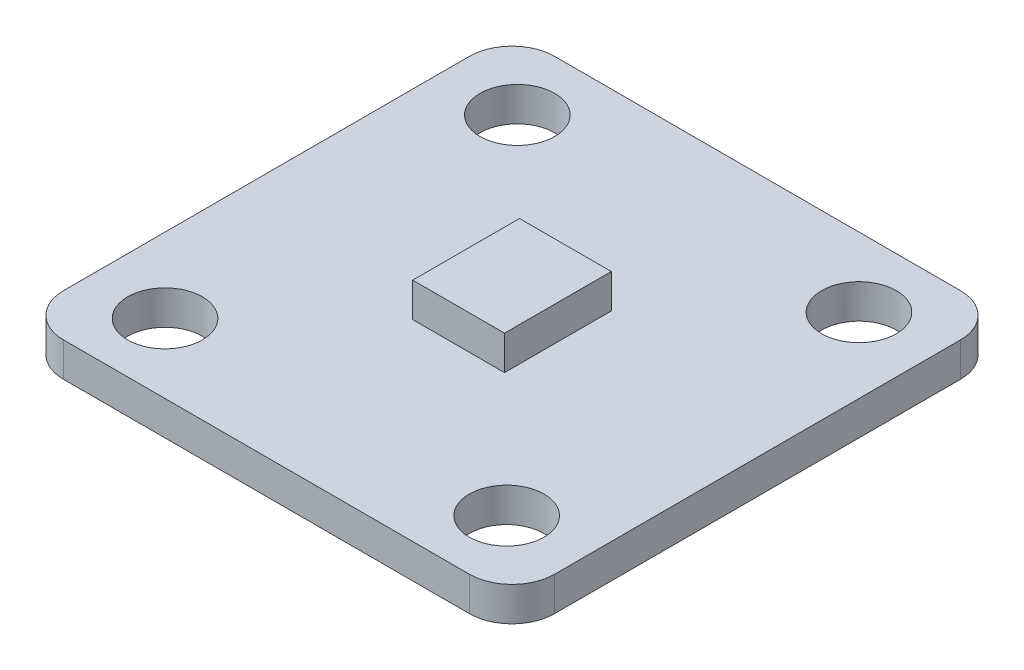
ISO-10303-21;
HEADER;
FILE_DESCRIPTION(('STEP AP214'),'2;1');
FILE_NAME('part.step','',(''),(''),'','','');
FILE_SCHEMA(('AUTOMOTIVE_DESIGN { 1 0 10303 214 1 1 1 1 }'));
ENDSEC;
DATA;
#1=APPLICATION_CONTEXT('core data for automotive mechanical design processes');
#2=APPLICATION_PROTOCOL_DEFINITION('international standard','automotive_design',2000,#1);
#3=PRODUCT_CONTEXT('',#1,'mechanical');
#4=PRODUCT('Part','Part','',(#3));
#5=PRODUCT_RELATED_PRODUCT_CATEGORY('part','',(#4));
#6=PRODUCT_DEFINITION_FORMATION('','',#4);
#7=PRODUCT_DEFINITION_CONTEXT('part definition',#1,'design');
#8=PRODUCT_DEFINITION('design','',#6,#7);
#9=PRODUCT_DEFINITION_SHAPE('','',#8);
#10=(LENGTH_UNIT() NAMED_UNIT(*) SI_UNIT(.MILLI.,.METRE.));
#11=(NAMED_UNIT(*) PLANE_ANGLE_UNIT() SI_UNIT($,.RADIAN.));
#12=(NAMED_UNIT(*) SI_UNIT($,.STERADIAN.) SOLID_ANGLE_UNIT());
#13=UNCERTAINTY_MEASURE_WITH_UNIT(LENGTH_MEASURE(1.E-05),#10,'distance_accuracy_value','');
#14=(GEOMETRIC_REPRESENTATION_CONTEXT(3) GLOBAL_UNCERTAINTY_ASSIGNED_CONTEXT((#13)) GLOBAL_UNIT_ASSIGNED_CONTEXT((#10,
#11,#12)) REPRESENTATION_CONTEXT('',''));
#15=CARTESIAN_POINT('',(0.,0.,0.));
#16=DIRECTION('',(0.,0.,1.));
#17=DIRECTION('',(1.,0.,0.));
#18=AXIS2_PLACEMENT_3D('',#15,#16,#17);
#19=CARTESIAN_POINT('',(0.,1.6,0.));
#20=DIRECTION('',(0.,1.,0.));
#21=DIRECTION('',(0.,0.,1.));
#22=AXIS2_PLACEMENT_3D('',#19,#20,#21);
#23=PLANE('',#22);
#24=CARTESIAN_POINT('',(-8.,1.6,8.25));
#25=DIRECTION('',(0.,1.,0.));
#26=DIRECTION('',(0.,0.,-1.));
#27=AXIS2_PLACEMENT_3D('',#24,#25,#26);
#28=CIRCLE('',#27,1.75);
#29=CARTESIAN_POINT('',(-8.,1.6,6.5));
#30=VERTEX_POINT('',#29);
#31=EDGE_CURVE('E150',#30,#30,#28,.T.);
#32=ORIENTED_EDGE('',*,*,#31,.F.);
#33=EDGE_LOOP('',(#32));
#34=FACE_BOUND('',#33,.T.);
#35=CARTESIAN_POINT('',(8.,1.6,8.25));
#36=DIRECTION('',(0.,1.,0.));
#37=DIRECTION('',(0.,0.,1.));
#38=AXIS2_PLACEMENT_3D('',#35,#36,#37);
#39=CIRCLE('',#38,1.75);
#40=CARTESIAN_POINT('',(8.,1.6,10.));
#41=VERTEX_POINT('',#40);
#42=EDGE_CURVE('E166',#41,#41,#39,.T.);
#43=ORIENTED_EDGE('',*,*,#42,.F.);
#44=EDGE_LOOP('',(#43));
#45=FACE_BOUND('',#44,.T.);
#46=CARTESIAN_POINT('',(8.,1.6,-8.25));
#47=DIRECTION('',(0.,1.,0.));
#48=DIRECTION('',(0.,0.,-1.));
#49=AXIS2_PLACEMENT_3D('',#46,#47,#48);
#50=CIRCLE('',#49,1.75);
#51=CARTESIAN_POINT('',(8.,1.6,-10.));
#52=VERTEX_POINT('',#51);
#53=EDGE_CURVE('E158',#52,#52,#50,.T.);
#54=ORIENTED_EDGE('',*,*,#53,.F.);
#55=EDGE_LOOP('',(#54));
#56=FACE_BOUND('',#55,.T.);
#57=CARTESIAN_POINT('',(-8.,1.6,-8.25));
#58=DIRECTION('',(0.,1.,0.));
#59=DIRECTION('',(0.,0.,1.));
#60=AXIS2_PLACEMENT_3D('',#57,#58,#59);
#61=CIRCLE('',#60,1.75);
#62=CARTESIAN_POINT('',(-8.,1.6,-6.5));
#63=VERTEX_POINT('',#62);
#64=EDGE_CURVE('E165',#63,#63,#61,.T.);
#65=ORIENTED_EDGE('',*,*,#64,.F.);
#66=EDGE_LOOP('',(#65));
#67=FACE_BOUND('',#66,.T.);
#68=DIRECTION('',(-1.,0.,0.));
#69=VECTOR('',#68,1.);
#70=CARTESIAN_POINT('',(-11.5,1.6,-11.5));
#71=LINE('',#70,#69);
#72=CARTESIAN_POINT('',(9.49999999999999,1.6,-11.5));
#73=VERTEX_POINT('',#72);
#74=CARTESIAN_POINT('',(-9.5,1.6,-11.5));
#75=VERTEX_POINT('',#74);
#76=EDGE_CURVE('E182',#73,#75,#71,.T.);
#77=ORIENTED_EDGE('',*,*,#76,.T.);
#78=CARTESIAN_POINT('',(-9.5,1.6,-9.5));
#79=DIRECTION('',(0.,1.,0.));
#80=DIRECTION('',(0.,0.,1.));
#81=AXIS2_PLACEMENT_3D('',#78,#79,#80);
#82=CIRCLE('',#81,2.);
#83=CARTESIAN_POINT('',(-11.5,1.6,-9.5));
#84=VERTEX_POINT('',#83);
#85=EDGE_CURVE('E224',#75,#84,#82,.T.);
#86=ORIENTED_EDGE('',*,*,#85,.T.);
#87=DIRECTION('',(0.,0.,1.));
#88=VECTOR('',#87,1.);
#89=CARTESIAN_POINT('',(-11.5,1.6,-11.5));
#90=LINE('',#89,#88);
#91=CARTESIAN_POINT('',(-11.5,1.6,9.5));
#92=VERTEX_POINT('',#91);
#93=EDGE_CURVE('E186',#84,#92,#90,.T.);
#94=ORIENTED_EDGE('',*,*,#93,.T.);
#95=CARTESIAN_POINT('',(-9.5,1.6,9.5));
#96=DIRECTION('',(0.,1.,0.));
#97=DIRECTION('',(0.,0.,1.));
#98=AXIS2_PLACEMENT_3D('',#95,#96,#97);
#99=CIRCLE('',#98,2.);
#100=CARTESIAN_POINT('',(-9.5,1.6,11.5));
#101=VERTEX_POINT('',#100);
#102=EDGE_CURVE('E218',#92,#101,#99,.T.);
#103=ORIENTED_EDGE('',*,*,#102,.T.);
#104=DIRECTION('',(1.,0.,0.));
#105=VECTOR('',#104,1.);
#106=CARTESIAN_POINT('',(-11.5,1.6,11.5));
#107=LINE('',#106,#105);
#108=CARTESIAN_POINT('',(9.5,1.6,11.5));
#109=VERTEX_POINT('',#108);
#110=EDGE_CURVE('E189',#101,#109,#107,.T.);
#111=ORIENTED_EDGE('',*,*,#110,.T.);
#112=CARTESIAN_POINT('',(9.5,1.6,9.5));
#113=DIRECTION('',(0.,1.,0.));
#114=DIRECTION('',(0.,0.,1.));
#115=AXIS2_PLACEMENT_3D('',#112,#113,#114);
#116=CIRCLE('',#115,2.);
#117=CARTESIAN_POINT('',(11.5,1.6,9.5));
#118=VERTEX_POINT('',#117);
#119=EDGE_CURVE('E220',#109,#118,#116,.T.);
#120=ORIENTED_EDGE('',*,*,#119,.T.);
#121=DIRECTION('',(0.,0.,-1.));
#122=VECTOR('',#121,1.);
#123=CARTESIAN_POINT('',(11.5,1.6,-11.5));
#124=LINE('',#123,#122);
#125=CARTESIAN_POINT('',(11.5,1.6,-9.5));
#126=VERTEX_POINT('',#125);
#127=EDGE_CURVE('E179',#118,#126,#124,.T.);
#128=ORIENTED_EDGE('',*,*,#127,.T.);
#129=CARTESIAN_POINT('',(9.49999999999999,1.6,-9.5));
#130=DIRECTION('',(0.,1.,0.));
#131=DIRECTION('',(0.,0.,1.));
#132=AXIS2_PLACEMENT_3D('',#129,#130,#131);
#133=CIRCLE('',#132,2.);
#134=EDGE_CURVE('E222',#126,#73,#133,.T.);
#135=ORIENTED_EDGE('',*,*,#134,.T.);
#136=EDGE_LOOP('',(#77,#86,#94,#103,#111,#120,#128,#135));
#137=FACE_BOUND('',#136,.T.);
#138=DIRECTION('',(-1.,0.,0.));
#139=VECTOR('',#138,1.);
#140=CARTESIAN_POINT('',(-2.15,1.6,-2.5));
#141=LINE('',#140,#139);
#142=CARTESIAN_POINT('',(2.15,1.6,-2.5));
#143=VERTEX_POINT('',#142);
#144=CARTESIAN_POINT('',(-2.15,1.6,-2.5));
#145=VERTEX_POINT('',#144);
#146=EDGE_CURVE('E410',#143,#145,#141,.T.);
#147=ORIENTED_EDGE('',*,*,#146,.F.);
#148=DIRECTION('',(0.,0.,-1.));
#149=VECTOR('',#148,1.);
#150=CARTESIAN_POINT('',(2.15,1.6,-2.5));
#151=LINE('',#150,#149);
#152=CARTESIAN_POINT('',(2.15,1.6,2.5));
#153=VERTEX_POINT('',#152);
#154=EDGE_CURVE('E148',#153,#143,#151,.T.);
#155=ORIENTED_EDGE('',*,*,#154,.F.);
#156=DIRECTION('',(1.,0.,0.));
#157=VECTOR('',#156,1.);
#158=CARTESIAN_POINT('',(-2.15,1.6,2.5));
#159=LINE('',#158,#157);
#160=CARTESIAN_POINT('',(-2.15,1.6,2.5));
#161=VERTEX_POINT('',#160);
#162=EDGE_CURVE('E144',#161,#153,#159,.T.);
#163=ORIENTED_EDGE('',*,*,#162,.F.);
#164=DIRECTION('',(0.,0.,1.));
#165=VECTOR('',#164,1.);
#166=CARTESIAN_POINT('',(-2.15,1.6,-2.5));
#167=LINE('',#166,#165);
#168=EDGE_CURVE('E407',#145,#161,#167,.T.);
#169=ORIENTED_EDGE('',*,*,#168,.F.);
#170=EDGE_LOOP('',(#147,#155,#163,#169));
#171=FACE_BOUND('',#170,.T.);
#172=ADVANCED_FACE('F36',(#34,#45,#56,#67,#137,#171),#23,.T.);
#173=CARTESIAN_POINT('',(11.5,1.6,-11.5));
#174=DIRECTION('',(-1.,0.,0.));
#175=DIRECTION('',(0.,0.,1.));
#176=AXIS2_PLACEMENT_3D('',#173,#174,#175);
#177=PLANE('',#176);
#178=DIRECTION('',(0.,0.,-1.));
#179=VECTOR('',#178,1.);
#180=CARTESIAN_POINT('',(11.5,0.,-11.5));
#181=LINE('',#180,#179);
#182=CARTESIAN_POINT('',(11.5,0.,9.5));
#183=VERTEX_POINT('',#182);
#184=CARTESIAN_POINT('',(11.5,0.,-9.5));
#185=VERTEX_POINT('',#184);
#186=EDGE_CURVE('E178',#183,#185,#181,.T.);
#187=ORIENTED_EDGE('',*,*,#186,.T.);
#188=DIRECTION('',(0.,-1.,0.));
#189=VECTOR('',#188,1.);
#190=CARTESIAN_POINT('',(11.5,1.6,-9.5));
#191=LINE('',#190,#189);
#192=EDGE_CURVE('E229',#185,#126,#191,.F.);
#193=ORIENTED_EDGE('',*,*,#192,.T.);
#194=ORIENTED_EDGE('',*,*,#127,.F.);
#195=DIRECTION('',(0.,-1.,0.));
#196=VECTOR('',#195,1.);
#197=CARTESIAN_POINT('',(11.5,1.6,9.5));
#198=LINE('',#197,#196);
#199=EDGE_CURVE('E226',#118,#183,#198,.T.);
#200=ORIENTED_EDGE('',*,*,#199,.T.);
#201=EDGE_LOOP('',(#187,#193,#194,#200));
#202=FACE_BOUND('',#201,.T.);
#203=ADVANCED_FACE('F246',(#202),#177,.F.);
#204=CARTESIAN_POINT('',(-11.5,1.6,-11.5));
#205=DIRECTION('',(0.,0.,1.));
#206=DIRECTION('',(1.,0.,0.));
#207=AXIS2_PLACEMENT_3D('',#204,#205,#206);
#208=PLANE('',#207);
#209=DIRECTION('',(-1.,0.,0.));
#210=VECTOR('',#209,1.);
#211=CARTESIAN_POINT('',(-11.5,0.,-11.5));
#212=LINE('',#211,#210);
#213=CARTESIAN_POINT('',(9.49999999999999,0.,-11.5));
#214=VERTEX_POINT('',#213);
#215=CARTESIAN_POINT('',(-9.5,0.,-11.5));
#216=VERTEX_POINT('',#215);
#217=EDGE_CURVE('E194',#214,#216,#212,.T.);
#218=ORIENTED_EDGE('',*,*,#217,.T.);
#219=DIRECTION('',(0.,-1.,0.));
#220=VECTOR('',#219,1.);
#221=CARTESIAN_POINT('',(-9.5,1.6,-11.5));
#222=LINE('',#221,#220);
#223=EDGE_CURVE('E216',#216,#75,#222,.F.);
#224=ORIENTED_EDGE('',*,*,#223,.T.);
#225=ORIENTED_EDGE('',*,*,#76,.F.);
#226=DIRECTION('',(0.,-1.,0.));
#227=VECTOR('',#226,1.);
#228=CARTESIAN_POINT('',(9.49999999999999,1.6,-11.5));
#229=LINE('',#228,#227);
#230=EDGE_CURVE('E213',#73,#214,#229,.T.);
#231=ORIENTED_EDGE('',*,*,#230,.T.);
#232=EDGE_LOOP('',(#218,#224,#225,#231));
#233=FACE_BOUND('',#232,.T.);
#234=ADVANCED_FACE('F257',(#233),#208,.F.);
#235=CARTESIAN_POINT('',(-11.5,1.6,-11.5));
#236=DIRECTION('',(1.,0.,0.));
#237=DIRECTION('',(0.,0.,-1.));
#238=AXIS2_PLACEMENT_3D('',#235,#236,#237);
#239=PLANE('',#238);
#240=ORIENTED_EDGE('',*,*,#93,.F.);
#241=DIRECTION('',(0.,-1.,0.));
#242=VECTOR('',#241,1.);
#243=CARTESIAN_POINT('',(-11.5,1.6,-9.5));
#244=LINE('',#243,#242);
#245=CARTESIAN_POINT('',(-11.5,0.,-9.5));
#246=VERTEX_POINT('',#245);
#247=EDGE_CURVE('E202',#84,#246,#244,.T.);
#248=ORIENTED_EDGE('',*,*,#247,.T.);
#249=DIRECTION('',(0.,0.,1.));
#250=VECTOR('',#249,1.);
#251=CARTESIAN_POINT('',(-11.5,0.,-11.5));
#252=LINE('',#251,#250);
#253=CARTESIAN_POINT('',(-11.5,0.,9.5));
#254=VERTEX_POINT('',#253);
#255=EDGE_CURVE('E197',#246,#254,#252,.T.);
#256=ORIENTED_EDGE('',*,*,#255,.T.);
#257=DIRECTION('',(0.,-1.,0.));
#258=VECTOR('',#257,1.);
#259=CARTESIAN_POINT('',(-11.5,1.6,9.5));
#260=LINE('',#259,#258);
#261=EDGE_CURVE('E191',#254,#92,#260,.F.);
#262=ORIENTED_EDGE('',*,*,#261,.T.);
#263=EDGE_LOOP('',(#240,#248,#256,#262));
#264=FACE_BOUND('',#263,.T.);
#265=ADVANCED_FACE('F265',(#264),#239,.F.);
#266=CARTESIAN_POINT('',(-11.5,1.6,11.5));
#267=DIRECTION('',(0.,0.,-1.));
#268=DIRECTION('',(-1.,0.,0.));
#269=AXIS2_PLACEMENT_3D('',#266,#267,#268);
#270=PLANE('',#269);
#271=DIRECTION('',(1.,0.,0.));
#272=VECTOR('',#271,1.);
#273=CARTESIAN_POINT('',(-11.5,0.,11.5));
#274=LINE('',#273,#272);
#275=CARTESIAN_POINT('',(-9.5,0.,11.5));
#276=VERTEX_POINT('',#275);
#277=CARTESIAN_POINT('',(9.5,0.,11.5));
#278=VERTEX_POINT('',#277);
#279=EDGE_CURVE('E183',#276,#278,#274,.T.);
#280=ORIENTED_EDGE('',*,*,#279,.T.);
#281=DIRECTION('',(0.,-1.,0.));
#282=VECTOR('',#281,1.);
#283=CARTESIAN_POINT('',(9.5,1.6,11.5));
#284=LINE('',#283,#282);
#285=EDGE_CURVE('E11',#278,#109,#284,.F.);
#286=ORIENTED_EDGE('',*,*,#285,.T.);
#287=ORIENTED_EDGE('',*,*,#110,.F.);
#288=DIRECTION('',(0.,-1.,0.));
#289=VECTOR('',#288,1.);
#290=CARTESIAN_POINT('',(-9.5,1.6,11.5));
#291=LINE('',#290,#289);
#292=EDGE_CURVE('E44',#101,#276,#291,.T.);
#293=ORIENTED_EDGE('',*,*,#292,.T.);
#294=EDGE_LOOP('',(#280,#286,#287,#293));
#295=FACE_BOUND('',#294,.T.);
#296=ADVANCED_FACE('F233',(#295),#270,.F.);
#297=CARTESIAN_POINT('',(0.,0.,0.));
#298=DIRECTION('',(0.,1.,0.));
#299=DIRECTION('',(0.,0.,1.));
#300=AXIS2_PLACEMENT_3D('',#297,#298,#299);
#301=PLANE('',#300);
#302=CARTESIAN_POINT('',(-8.,0.,8.25));
#303=DIRECTION('',(0.,1.,0.));
#304=DIRECTION('',(0.,0.,1.));
#305=AXIS2_PLACEMENT_3D('',#302,#303,#304);
#306=CIRCLE('',#305,1.75);
#307=CARTESIAN_POINT('',(-8.,0.,10.));
#308=VERTEX_POINT('',#307);
#309=EDGE_CURVE('E153',#308,#308,#306,.F.);
#310=ORIENTED_EDGE('',*,*,#309,.F.);
#311=EDGE_LOOP('',(#310));
#312=FACE_BOUND('',#311,.T.);
#313=CARTESIAN_POINT('',(8.,0.,8.25));
#314=DIRECTION('',(0.,1.,0.));
#315=DIRECTION('',(0.,0.,1.));
#316=AXIS2_PLACEMENT_3D('',#313,#314,#315);
#317=CIRCLE('',#316,1.75);
#318=CARTESIAN_POINT('',(8.,0.,10.));
#319=VERTEX_POINT('',#318);
#320=EDGE_CURVE('E162',#319,#319,#317,.F.);
#321=ORIENTED_EDGE('',*,*,#320,.F.);
#322=EDGE_LOOP('',(#321));
#323=FACE_BOUND('',#322,.T.);
#324=CARTESIAN_POINT('',(8.,0.,-8.25));
#325=DIRECTION('',(0.,1.,0.));
#326=DIRECTION('',(0.,0.,1.));
#327=AXIS2_PLACEMENT_3D('',#324,#325,#326);
#328=CIRCLE('',#327,1.75);
#329=CARTESIAN_POINT('',(8.,0.,-6.5));
#330=VERTEX_POINT('',#329);
#331=EDGE_CURVE('E161',#330,#330,#328,.F.);
#332=ORIENTED_EDGE('',*,*,#331,.F.);
#333=EDGE_LOOP('',(#332));
#334=FACE_BOUND('',#333,.T.);
#335=CARTESIAN_POINT('',(-8.,0.,-8.25));
#336=DIRECTION('',(0.,1.,0.));
#337=DIRECTION('',(0.,0.,1.));
#338=AXIS2_PLACEMENT_3D('',#335,#336,#337);
#339=CIRCLE('',#338,1.75);
#340=CARTESIAN_POINT('',(-8.,0.,-6.5));
#341=VERTEX_POINT('',#340);
#342=EDGE_CURVE('E175',#341,#341,#339,.F.);
#343=ORIENTED_EDGE('',*,*,#342,.F.);
#344=EDGE_LOOP('',(#343));
#345=FACE_BOUND('',#344,.T.);
#346=ORIENTED_EDGE('',*,*,#255,.F.);
#347=CARTESIAN_POINT('',(-9.5,0.,-9.5));
#348=DIRECTION('',(0.,1.,0.));
#349=DIRECTION('',(0.,0.,1.));
#350=AXIS2_PLACEMENT_3D('',#347,#348,#349);
#351=CIRCLE('',#350,2.);
#352=EDGE_CURVE('E211',#246,#216,#351,.F.);
#353=ORIENTED_EDGE('',*,*,#352,.T.);
#354=ORIENTED_EDGE('',*,*,#217,.F.);
#355=CARTESIAN_POINT('',(9.49999999999999,0.,-9.5));
#356=DIRECTION('',(0.,1.,0.));
#357=DIRECTION('',(0.,0.,1.));
#358=AXIS2_PLACEMENT_3D('',#355,#356,#357);
#359=CIRCLE('',#358,2.);
#360=EDGE_CURVE('E209',#214,#185,#359,.F.);
#361=ORIENTED_EDGE('',*,*,#360,.T.);
#362=ORIENTED_EDGE('',*,*,#186,.F.);
#363=CARTESIAN_POINT('',(9.5,0.,9.5));
#364=DIRECTION('',(0.,1.,0.));
#365=DIRECTION('',(0.,0.,1.));
#366=AXIS2_PLACEMENT_3D('',#363,#364,#365);
#367=CIRCLE('',#366,2.);
#368=EDGE_CURVE('E207',#183,#278,#367,.F.);
#369=ORIENTED_EDGE('',*,*,#368,.T.);
#370=ORIENTED_EDGE('',*,*,#279,.F.);
#371=CARTESIAN_POINT('',(-9.5,0.,9.5));
#372=DIRECTION('',(0.,1.,0.));
#373=DIRECTION('',(0.,0.,1.));
#374=AXIS2_PLACEMENT_3D('',#371,#372,#373);
#375=CIRCLE('',#374,2.);
#376=EDGE_CURVE('E205',#276,#254,#375,.F.);
#377=ORIENTED_EDGE('',*,*,#376,.T.);
#378=EDGE_LOOP('',(#346,#353,#354,#361,#362,#369,#370,#377));
#379=FACE_BOUND('',#378,.T.);
#380=ADVANCED_FACE('F238',(#312,#323,#334,#345,#379),#301,.F.);
#381=CARTESIAN_POINT('',(-9.5,1.6,-9.5));
#382=DIRECTION('',(0.,-1.,0.));
#383=DIRECTION('',(0.,0.,-1.));
#384=AXIS2_PLACEMENT_3D('',#381,#382,#383);
#385=CYLINDRICAL_SURFACE('',#384,2.);
#386=ORIENTED_EDGE('',*,*,#85,.F.);
#387=ORIENTED_EDGE('',*,*,#223,.F.);
#388=ORIENTED_EDGE('',*,*,#352,.F.);
#389=ORIENTED_EDGE('',*,*,#247,.F.);
#390=EDGE_LOOP('',(#386,#387,#388,#389));
#391=FACE_BOUND('',#390,.T.);
#392=ADVANCED_FACE('F262',(#391),#385,.T.);
#393=CARTESIAN_POINT('',(9.49999999999999,1.6,-9.5));
#394=DIRECTION('',(0.,-1.,0.));
#395=DIRECTION('',(0.,0.,-1.));
#396=AXIS2_PLACEMENT_3D('',#393,#394,#395);
#397=CYLINDRICAL_SURFACE('',#396,2.);
#398=ORIENTED_EDGE('',*,*,#134,.F.);
#399=ORIENTED_EDGE('',*,*,#192,.F.);
#400=ORIENTED_EDGE('',*,*,#360,.F.);
#401=ORIENTED_EDGE('',*,*,#230,.F.);
#402=EDGE_LOOP('',(#398,#399,#400,#401));
#403=FACE_BOUND('',#402,.T.);
#404=ADVANCED_FACE('F254',(#403),#397,.T.);
#405=CARTESIAN_POINT('',(9.5,1.6,9.5));
#406=DIRECTION('',(0.,-1.,0.));
#407=DIRECTION('',(0.,0.,-1.));
#408=AXIS2_PLACEMENT_3D('',#405,#406,#407);
#409=CYLINDRICAL_SURFACE('',#408,2.);
#410=ORIENTED_EDGE('',*,*,#119,.F.);
#411=ORIENTED_EDGE('',*,*,#285,.F.);
#412=ORIENTED_EDGE('',*,*,#368,.F.);
#413=ORIENTED_EDGE('',*,*,#199,.F.);
#414=EDGE_LOOP('',(#410,#411,#412,#413));
#415=FACE_BOUND('',#414,.T.);
#416=ADVANCED_FACE('F243',(#415),#409,.T.);
#417=CARTESIAN_POINT('',(-9.5,1.6,9.5));
#418=DIRECTION('',(0.,-1.,0.));
#419=DIRECTION('',(0.,0.,-1.));
#420=AXIS2_PLACEMENT_3D('',#417,#418,#419);
#421=CYLINDRICAL_SURFACE('',#420,2.);
#422=ORIENTED_EDGE('',*,*,#102,.F.);
#423=ORIENTED_EDGE('',*,*,#261,.F.);
#424=ORIENTED_EDGE('',*,*,#376,.F.);
#425=ORIENTED_EDGE('',*,*,#292,.F.);
#426=EDGE_LOOP('',(#422,#423,#424,#425));
#427=FACE_BOUND('',#426,.T.);
#428=ADVANCED_FACE('F38',(#427),#421,.T.);
#429=CARTESIAN_POINT('',(-8.,-0.000999999999999916,-8.25));
#430=DIRECTION('',(0.,1.,0.));
#431=DIRECTION('',(0.,0.,1.));
#432=AXIS2_PLACEMENT_3D('',#429,#430,#431);
#433=CYLINDRICAL_SURFACE('',#432,1.75);
#434=ORIENTED_EDGE('',*,*,#64,.T.);
#435=EDGE_LOOP('',(#434));
#436=FACE_BOUND('',#435,.T.);
#437=ORIENTED_EDGE('',*,*,#342,.T.);
#438=EDGE_LOOP('',(#437));
#439=FACE_BOUND('',#438,.T.);
#440=ADVANCED_FACE('F268',(#436,#439),#433,.F.);
#441=CARTESIAN_POINT('',(8.,-0.000999999999999916,-8.25));
#442=DIRECTION('',(0.,1.,0.));
#443=DIRECTION('',(0.,0.,1.));
#444=AXIS2_PLACEMENT_3D('',#441,#442,#443);
#445=CYLINDRICAL_SURFACE('',#444,1.75);
#446=ORIENTED_EDGE('',*,*,#53,.T.);
#447=EDGE_LOOP('',(#446));
#448=FACE_BOUND('',#447,.T.);
#449=ORIENTED_EDGE('',*,*,#331,.T.);
#450=EDGE_LOOP('',(#449));
#451=FACE_BOUND('',#450,.T.);
#452=ADVANCED_FACE('F273',(#448,#451),#445,.F.);
#453=CARTESIAN_POINT('',(8.,-0.000999999999999916,8.25));
#454=DIRECTION('',(0.,1.,0.));
#455=DIRECTION('',(0.,0.,1.));
#456=AXIS2_PLACEMENT_3D('',#453,#454,#455);
#457=CYLINDRICAL_SURFACE('',#456,1.75);
#458=ORIENTED_EDGE('',*,*,#42,.T.);
#459=EDGE_LOOP('',(#458));
#460=FACE_BOUND('',#459,.T.);
#461=ORIENTED_EDGE('',*,*,#320,.T.);
#462=EDGE_LOOP('',(#461));
#463=FACE_BOUND('',#462,.T.);
#464=ADVANCED_FACE('F334',(#460,#463),#457,.F.);
#465=CARTESIAN_POINT('',(-8.,-0.000999999999999916,8.25));
#466=DIRECTION('',(0.,1.,0.));
#467=DIRECTION('',(0.,0.,1.));
#468=AXIS2_PLACEMENT_3D('',#465,#466,#467);
#469=CYLINDRICAL_SURFACE('',#468,1.75);
#470=ORIENTED_EDGE('',*,*,#31,.T.);
#471=EDGE_LOOP('',(#470));
#472=FACE_BOUND('',#471,.T.);
#473=ORIENTED_EDGE('',*,*,#309,.T.);
#474=EDGE_LOOP('',(#473));
#475=FACE_BOUND('',#474,.T.);
#476=ADVANCED_FACE('F344',(#472,#475),#469,.F.);
#477=CARTESIAN_POINT('',(2.15,3.2,-2.5));
#478=DIRECTION('',(-1.,0.,0.));
#479=DIRECTION('',(0.,0.,1.));
#480=AXIS2_PLACEMENT_3D('',#477,#478,#479);
#481=PLANE('',#480);
#482=ORIENTED_EDGE('',*,*,#154,.T.);
#483=DIRECTION('',(0.,-1.,0.));
#484=VECTOR('',#483,1.);
#485=CARTESIAN_POINT('',(2.15,3.2,-2.5));
#486=LINE('',#485,#484);
#487=CARTESIAN_POINT('',(2.15,3.2,-2.5));
#488=VERTEX_POINT('',#487);
#489=EDGE_CURVE('E129',#488,#143,#486,.T.);
#490=ORIENTED_EDGE('',*,*,#489,.F.);
#491=DIRECTION('',(0.,0.,-1.));
#492=VECTOR('',#491,1.);
#493=CARTESIAN_POINT('',(2.15,3.2,-2.5));
#494=LINE('',#493,#492);
#495=CARTESIAN_POINT('',(2.15,3.2,2.5));
#496=VERTEX_POINT('',#495);
#497=EDGE_CURVE('E136',#496,#488,#494,.T.);
#498=ORIENTED_EDGE('',*,*,#497,.F.);
#499=DIRECTION('',(0.,-1.,0.));
#500=VECTOR('',#499,1.);
#501=CARTESIAN_POINT('',(2.15,3.2,2.5));
#502=LINE('',#501,#500);
#503=EDGE_CURVE('E405',#496,#153,#502,.T.);
#504=ORIENTED_EDGE('',*,*,#503,.T.);
#505=EDGE_LOOP('',(#482,#490,#498,#504));
#506=FACE_BOUND('',#505,.T.);
#507=ADVANCED_FACE('F146',(#506),#481,.F.);
#508=CARTESIAN_POINT('',(-2.15,3.2,-2.5));
#509=DIRECTION('',(0.,0.,1.));
#510=DIRECTION('',(1.,0.,0.));
#511=AXIS2_PLACEMENT_3D('',#508,#509,#510);
#512=PLANE('',#511);
#513=ORIENTED_EDGE('',*,*,#146,.T.);
#514=DIRECTION('',(0.,-1.,0.));
#515=VECTOR('',#514,1.);
#516=CARTESIAN_POINT('',(-2.15,3.2,-2.5));
#517=LINE('',#516,#515);
#518=CARTESIAN_POINT('',(-2.15,3.2,-2.5));
#519=VERTEX_POINT('',#518);
#520=EDGE_CURVE('E132',#519,#145,#517,.T.);
#521=ORIENTED_EDGE('',*,*,#520,.F.);
#522=DIRECTION('',(-1.,0.,0.));
#523=VECTOR('',#522,1.);
#524=CARTESIAN_POINT('',(-2.15,3.2,-2.5));
#525=LINE('',#524,#523);
#526=EDGE_CURVE('E125',#488,#519,#525,.T.);
#527=ORIENTED_EDGE('',*,*,#526,.F.);
#528=ORIENTED_EDGE('',*,*,#489,.T.);
#529=EDGE_LOOP('',(#513,#521,#527,#528));
#530=FACE_BOUND('',#529,.T.);
#531=ADVANCED_FACE('F127',(#530),#512,.F.);
#532=CARTESIAN_POINT('',(-2.15,3.2,-2.5));
#533=DIRECTION('',(1.,0.,0.));
#534=DIRECTION('',(0.,0.,-1.));
#535=AXIS2_PLACEMENT_3D('',#532,#533,#534);
#536=PLANE('',#535);
#537=ORIENTED_EDGE('',*,*,#168,.T.);
#538=DIRECTION('',(0.,-1.,0.));
#539=VECTOR('',#538,1.);
#540=CARTESIAN_POINT('',(-2.15,3.2,2.5));
#541=LINE('',#540,#539);
#542=CARTESIAN_POINT('',(-2.15,3.2,2.5));
#543=VERTEX_POINT('',#542);
#544=EDGE_CURVE('E51',#543,#161,#541,.T.);
#545=ORIENTED_EDGE('',*,*,#544,.F.);
#546=DIRECTION('',(0.,0.,1.));
#547=VECTOR('',#546,1.);
#548=CARTESIAN_POINT('',(-2.15,3.2,-2.5));
#549=LINE('',#548,#547);
#550=EDGE_CURVE('E135',#519,#543,#549,.T.);
#551=ORIENTED_EDGE('',*,*,#550,.F.);
#552=ORIENTED_EDGE('',*,*,#520,.T.);
#553=EDGE_LOOP('',(#537,#545,#551,#552));
#554=FACE_BOUND('',#553,.T.);
#555=ADVANCED_FACE('F374',(#554),#536,.F.);
#556=CARTESIAN_POINT('',(-2.15,3.2,2.5));
#557=DIRECTION('',(0.,0.,-1.));
#558=DIRECTION('',(-1.,0.,0.));
#559=AXIS2_PLACEMENT_3D('',#556,#557,#558);
#560=PLANE('',#559);
#561=ORIENTED_EDGE('',*,*,#162,.T.);
#562=ORIENTED_EDGE('',*,*,#503,.F.);
#563=DIRECTION('',(1.,0.,0.));
#564=VECTOR('',#563,1.);
#565=CARTESIAN_POINT('',(-2.15,3.2,2.5));
#566=LINE('',#565,#564);
#567=EDGE_CURVE('E140',#543,#496,#566,.T.);
#568=ORIENTED_EDGE('',*,*,#567,.F.);
#569=ORIENTED_EDGE('',*,*,#544,.T.);
#570=EDGE_LOOP('',(#561,#562,#568,#569));
#571=FACE_BOUND('',#570,.T.);
#572=ADVANCED_FACE('F383',(#571),#560,.F.);
#573=CARTESIAN_POINT('',(0.,3.2,0.));
#574=DIRECTION('',(0.,1.,0.));
#575=DIRECTION('',(0.,0.,1.));
#576=AXIS2_PLACEMENT_3D('',#573,#574,#575);
#577=PLANE('',#576);
#578=ORIENTED_EDGE('',*,*,#497,.T.);
#579=ORIENTED_EDGE('',*,*,#526,.T.);
#580=ORIENTED_EDGE('',*,*,#550,.T.);
#581=ORIENTED_EDGE('',*,*,#567,.T.);
#582=EDGE_LOOP('',(#578,#579,#580,#581));
#583=FACE_BOUND('',#582,.T.);
#584=ADVANCED_FACE('F139',(#583),#577,.T.);
#585=CLOSED_SHELL('',(#172,#203,#234,#265,#296,#380,#392,#404,#416,#428,#440,#452,#464,#476,
#507,#531,#555,#572,#584));
#586=MANIFOLD_SOLID_BREP('B2',#585);
#587=ADVANCED_BREP_SHAPE_REPRESENTATION('',(#18,#586),#14);
#588=SHAPE_DEFINITION_REPRESENTATION(#9,#587);
ENDSEC;
END-ISO-10303-21;
